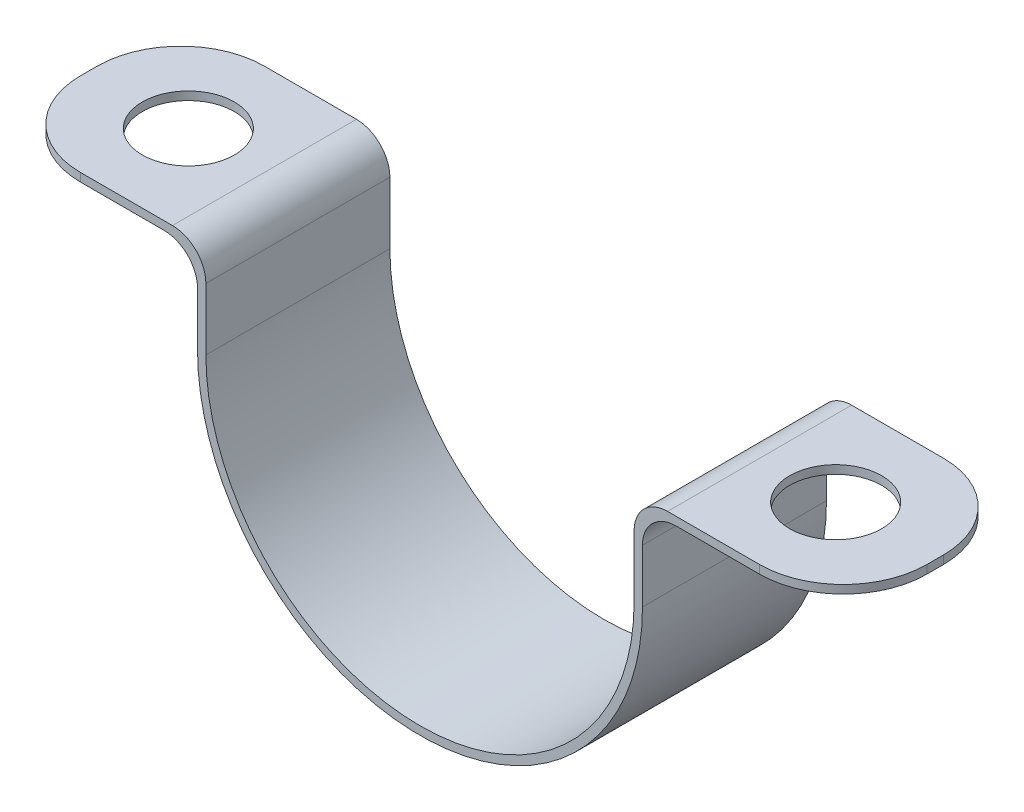
ISO-10303-21;
HEADER;
FILE_DESCRIPTION(('STEP AP214'),'2;1');
FILE_NAME('part.step','',(''),(''),'','','');
FILE_SCHEMA(('AUTOMOTIVE_DESIGN { 1 0 10303 214 1 1 1 1 }'));
ENDSEC;
DATA;
#1=APPLICATION_CONTEXT('core data for automotive mechanical design processes');
#2=APPLICATION_PROTOCOL_DEFINITION('international standard','automotive_design',2000,#1);
#3=PRODUCT_CONTEXT('',#1,'mechanical');
#4=PRODUCT('Part','Part','',(#3));
#5=PRODUCT_RELATED_PRODUCT_CATEGORY('part','',(#4));
#6=PRODUCT_DEFINITION_FORMATION('','',#4);
#7=PRODUCT_DEFINITION_CONTEXT('part definition',#1,'design');
#8=PRODUCT_DEFINITION('design','',#6,#7);
#9=PRODUCT_DEFINITION_SHAPE('','',#8);
#10=(LENGTH_UNIT() NAMED_UNIT(*) SI_UNIT(.MILLI.,.METRE.));
#11=(NAMED_UNIT(*) PLANE_ANGLE_UNIT() SI_UNIT($,.RADIAN.));
#12=(NAMED_UNIT(*) SI_UNIT($,.STERADIAN.) SOLID_ANGLE_UNIT());
#13=UNCERTAINTY_MEASURE_WITH_UNIT(LENGTH_MEASURE(1.E-05),#10,'distance_accuracy_value','');
#14=(GEOMETRIC_REPRESENTATION_CONTEXT(3) GLOBAL_UNCERTAINTY_ASSIGNED_CONTEXT((#13)) GLOBAL_UNIT_ASSIGNED_CONTEXT((#10,
#11,#12)) REPRESENTATION_CONTEXT('',''));
#15=CARTESIAN_POINT('',(0.,0.,0.));
#16=DIRECTION('',(0.,0.,1.));
#17=DIRECTION('',(1.,0.,0.));
#18=AXIS2_PLACEMENT_3D('',#15,#16,#17);
#19=CARTESIAN_POINT('',(0.,0.,-11.));
#20=DIRECTION('',(0.,0.,1.));
#21=DIRECTION('',(1.,0.,0.));
#22=AXIS2_PLACEMENT_3D('',#19,#20,#21);
#23=CYLINDRICAL_SURFACE('',#22,12.8);
#24=CARTESIAN_POINT('',(0.,0.,0.));
#25=DIRECTION('',(0.,0.,-1.));
#26=DIRECTION('',(1.,0.,0.));
#27=AXIS2_PLACEMENT_3D('',#24,#25,#26);
#28=CIRCLE('',#27,12.8);
#29=CARTESIAN_POINT('',(12.8,0.,0.));
#30=VERTEX_POINT('',#29);
#31=CARTESIAN_POINT('',(-12.8,0.,0.));
#32=VERTEX_POINT('',#31);
#33=EDGE_CURVE('E242',#30,#32,#28,.T.);
#34=ORIENTED_EDGE('',*,*,#33,.F.);
#35=DIRECTION('',(0.,0.,1.));
#36=VECTOR('',#35,1.);
#37=CARTESIAN_POINT('',(12.8,0.,-11.));
#38=LINE('',#37,#36);
#39=CARTESIAN_POINT('',(12.8,0.,-11.));
#40=VERTEX_POINT('',#39);
#41=EDGE_CURVE('E203',#40,#30,#38,.T.);
#42=ORIENTED_EDGE('',*,*,#41,.F.);
#43=CARTESIAN_POINT('',(0.,0.,-11.));
#44=DIRECTION('',(0.,0.,-1.));
#45=DIRECTION('',(1.,0.,0.));
#46=AXIS2_PLACEMENT_3D('',#43,#44,#45);
#47=CIRCLE('',#46,12.8);
#48=CARTESIAN_POINT('',(-12.8,0.,-11.));
#49=VERTEX_POINT('',#48);
#50=EDGE_CURVE('E197',#40,#49,#47,.T.);
#51=ORIENTED_EDGE('',*,*,#50,.T.);
#52=DIRECTION('',(0.,0.,1.));
#53=VECTOR('',#52,1.);
#54=CARTESIAN_POINT('',(-12.8,0.,-11.));
#55=LINE('',#54,#53);
#56=EDGE_CURVE('E178',#49,#32,#55,.T.);
#57=ORIENTED_EDGE('',*,*,#56,.T.);
#58=EDGE_LOOP('',(#34,#42,#51,#57));
#59=FACE_BOUND('',#58,.T.);
#60=ADVANCED_FACE('F39',(#59),#23,.F.);
#61=CARTESIAN_POINT('',(12.8,0.,-11.));
#62=DIRECTION('',(-1.,0.,0.));
#63=DIRECTION('',(0.,-1.,0.));
#64=AXIS2_PLACEMENT_3D('',#61,#62,#63);
#65=PLANE('',#64);
#66=DIRECTION('',(0.,-1.,0.));
#67=VECTOR('',#66,1.);
#68=CARTESIAN_POINT('',(12.8,0.,0.));
#69=LINE('',#68,#67);
#70=CARTESIAN_POINT('',(12.8,3.7,0.));
#71=VERTEX_POINT('',#70);
#72=EDGE_CURVE('E204',#71,#30,#69,.T.);
#73=ORIENTED_EDGE('',*,*,#72,.F.);
#74=DIRECTION('',(0.,0.,1.));
#75=VECTOR('',#74,1.);
#76=CARTESIAN_POINT('',(12.8,3.7,-11.));
#77=LINE('',#76,#75);
#78=CARTESIAN_POINT('',(12.8,3.7,-11.));
#79=VERTEX_POINT('',#78);
#80=EDGE_CURVE('E277',#79,#71,#77,.T.);
#81=ORIENTED_EDGE('',*,*,#80,.F.);
#82=DIRECTION('',(0.,-1.,0.));
#83=VECTOR('',#82,1.);
#84=CARTESIAN_POINT('',(12.8,0.,-11.));
#85=LINE('',#84,#83);
#86=EDGE_CURVE('E189',#79,#40,#85,.T.);
#87=ORIENTED_EDGE('',*,*,#86,.T.);
#88=ORIENTED_EDGE('',*,*,#41,.T.);
#89=EDGE_LOOP('',(#73,#81,#87,#88));
#90=FACE_BOUND('',#89,.T.);
#91=ADVANCED_FACE('F365',(#90),#65,.T.);
#92=CARTESIAN_POINT('',(14.8,3.7,-11.));
#93=DIRECTION('',(0.,0.,1.));
#94=DIRECTION('',(1.,0.,0.));
#95=AXIS2_PLACEMENT_3D('',#92,#93,#94);
#96=CYLINDRICAL_SURFACE('',#95,2.);
#97=CARTESIAN_POINT('',(14.8,3.7,0.));
#98=DIRECTION('',(0.,0.,1.));
#99=DIRECTION('',(-1.,0.,0.));
#100=AXIS2_PLACEMENT_3D('',#97,#98,#99);
#101=CIRCLE('',#100,2.);
#102=CARTESIAN_POINT('',(14.8,5.7,0.));
#103=VERTEX_POINT('',#102);
#104=EDGE_CURVE('E207',#103,#71,#101,.T.);
#105=ORIENTED_EDGE('',*,*,#104,.F.);
#106=DIRECTION('',(0.,0.,1.));
#107=VECTOR('',#106,1.);
#108=CARTESIAN_POINT('',(14.8,5.7,-11.));
#109=LINE('',#108,#107);
#110=CARTESIAN_POINT('',(14.8,5.7,-11.));
#111=VERTEX_POINT('',#110);
#112=EDGE_CURVE('E279',#111,#103,#109,.T.);
#113=ORIENTED_EDGE('',*,*,#112,.F.);
#114=CARTESIAN_POINT('',(14.8,3.7,-11.));
#115=DIRECTION('',(0.,0.,1.));
#116=DIRECTION('',(-1.,0.,0.));
#117=AXIS2_PLACEMENT_3D('',#114,#115,#116);
#118=CIRCLE('',#117,2.);
#119=EDGE_CURVE('E238',#111,#79,#118,.T.);
#120=ORIENTED_EDGE('',*,*,#119,.T.);
#121=ORIENTED_EDGE('',*,*,#80,.T.);
#122=EDGE_LOOP('',(#105,#113,#120,#121));
#123=FACE_BOUND('',#122,.T.);
#124=ADVANCED_FACE('F370',(#123),#96,.T.);
#125=CARTESIAN_POINT('',(14.8,5.7,-11.));
#126=DIRECTION('',(0.,1.,0.));
#127=DIRECTION('',(-1.,0.,0.));
#128=AXIS2_PLACEMENT_3D('',#125,#126,#127);
#129=PLANE('',#128);
#130=CARTESIAN_POINT('',(19.35,5.7,-5.5));
#131=DIRECTION('',(0.,1.,0.));
#132=DIRECTION('',(-1.,0.,0.));
#133=AXIS2_PLACEMENT_3D('',#130,#131,#132);
#134=CIRCLE('',#133,2.75);
#135=CARTESIAN_POINT('',(16.6,5.7,-5.5));
#136=VERTEX_POINT('',#135);
#137=EDGE_CURVE('E210',#136,#136,#134,.F.);
#138=ORIENTED_EDGE('',*,*,#137,.T.);
#139=EDGE_LOOP('',(#138));
#140=FACE_BOUND('',#139,.T.);
#141=DIRECTION('',(-1.,0.,0.));
#142=VECTOR('',#141,1.);
#143=CARTESIAN_POINT('',(14.8,5.7,0.));
#144=LINE('',#143,#142);
#145=CARTESIAN_POINT('',(20.3,5.7,0.));
#146=VERTEX_POINT('',#145);
#147=EDGE_CURVE('E271',#146,#103,#144,.T.);
#148=ORIENTED_EDGE('',*,*,#147,.F.);
#149=CARTESIAN_POINT('',(20.3,5.7,-5.));
#150=DIRECTION('',(0.,1.,0.));
#151=DIRECTION('',(-1.,0.,0.));
#152=AXIS2_PLACEMENT_3D('',#149,#150,#151);
#153=CIRCLE('',#152,5.);
#154=CARTESIAN_POINT('',(25.3,5.7,-5.));
#155=VERTEX_POINT('',#154);
#156=EDGE_CURVE('E315',#146,#155,#153,.T.);
#157=ORIENTED_EDGE('',*,*,#156,.T.);
#158=DIRECTION('',(0.,0.,1.));
#159=VECTOR('',#158,1.);
#160=CARTESIAN_POINT('',(25.3,5.7,-11.));
#161=LINE('',#160,#159);
#162=CARTESIAN_POINT('',(25.3,5.7,-6.));
#163=VERTEX_POINT('',#162);
#164=EDGE_CURVE('E282',#163,#155,#161,.T.);
#165=ORIENTED_EDGE('',*,*,#164,.F.);
#166=CARTESIAN_POINT('',(20.3,5.7,-6.));
#167=DIRECTION('',(0.,1.,0.));
#168=DIRECTION('',(-1.,0.,0.));
#169=AXIS2_PLACEMENT_3D('',#166,#167,#168);
#170=CIRCLE('',#169,5.);
#171=CARTESIAN_POINT('',(20.3,5.7,-11.));
#172=VERTEX_POINT('',#171);
#173=EDGE_CURVE('E313',#163,#172,#170,.T.);
#174=ORIENTED_EDGE('',*,*,#173,.T.);
#175=DIRECTION('',(-1.,0.,0.));
#176=VECTOR('',#175,1.);
#177=CARTESIAN_POINT('',(14.8,5.7,-11.));
#178=LINE('',#177,#176);
#179=EDGE_CURVE('E236',#172,#111,#178,.T.);
#180=ORIENTED_EDGE('',*,*,#179,.T.);
#181=ORIENTED_EDGE('',*,*,#112,.T.);
#182=EDGE_LOOP('',(#148,#157,#165,#174,#180,#181));
#183=FACE_BOUND('',#182,.T.);
#184=ADVANCED_FACE('F352',(#140,#183),#129,.T.);
#185=CARTESIAN_POINT('',(25.3,5.7,-11.));
#186=DIRECTION('',(1.,0.,0.));
#187=DIRECTION('',(0.,0.,-1.));
#188=AXIS2_PLACEMENT_3D('',#185,#186,#187);
#189=PLANE('',#188);
#190=ORIENTED_EDGE('',*,*,#164,.T.);
#191=DIRECTION('',(0.,1.,0.));
#192=VECTOR('',#191,1.);
#193=CARTESIAN_POINT('',(25.3,5.7,-5.));
#194=LINE('',#193,#192);
#195=CARTESIAN_POINT('',(25.3,5.2,-5.));
#196=VERTEX_POINT('',#195);
#197=EDGE_CURVE('E320',#155,#196,#194,.F.);
#198=ORIENTED_EDGE('',*,*,#197,.T.);
#199=DIRECTION('',(0.,0.,1.));
#200=VECTOR('',#199,1.);
#201=CARTESIAN_POINT('',(25.3,5.2,-11.));
#202=LINE('',#201,#200);
#203=CARTESIAN_POINT('',(25.3,5.2,-6.));
#204=VERTEX_POINT('',#203);
#205=EDGE_CURVE('E285',#204,#196,#202,.T.);
#206=ORIENTED_EDGE('',*,*,#205,.F.);
#207=DIRECTION('',(0.,1.,0.));
#208=VECTOR('',#207,1.);
#209=CARTESIAN_POINT('',(25.3,5.7,-6.));
#210=LINE('',#209,#208);
#211=EDGE_CURVE('E317',#204,#163,#210,.T.);
#212=ORIENTED_EDGE('',*,*,#211,.T.);
#213=EDGE_LOOP('',(#190,#198,#206,#212));
#214=FACE_BOUND('',#213,.T.);
#215=ADVANCED_FACE('F438',(#214),#189,.T.);
#216=CARTESIAN_POINT('',(25.3,5.2,-11.));
#217=DIRECTION('',(0.,-1.,0.));
#218=DIRECTION('',(1.,0.,0.));
#219=AXIS2_PLACEMENT_3D('',#216,#217,#218);
#220=PLANE('',#219);
#221=CARTESIAN_POINT('',(19.35,5.2,-5.5));
#222=DIRECTION('',(0.,-1.,0.));
#223=DIRECTION('',(1.,0.,0.));
#224=AXIS2_PLACEMENT_3D('',#221,#222,#223);
#225=CIRCLE('',#224,2.75);
#226=CARTESIAN_POINT('',(22.1,5.2,-5.5));
#227=VERTEX_POINT('',#226);
#228=EDGE_CURVE('E43',#227,#227,#225,.F.);
#229=ORIENTED_EDGE('',*,*,#228,.T.);
#230=EDGE_LOOP('',(#229));
#231=FACE_BOUND('',#230,.T.);
#232=ORIENTED_EDGE('',*,*,#205,.T.);
#233=CARTESIAN_POINT('',(20.3,5.2,-5.));
#234=DIRECTION('',(0.,-1.,0.));
#235=DIRECTION('',(1.,0.,0.));
#236=AXIS2_PLACEMENT_3D('',#233,#234,#235);
#237=CIRCLE('',#236,5.);
#238=CARTESIAN_POINT('',(20.3,5.2,0.));
#239=VERTEX_POINT('',#238);
#240=EDGE_CURVE('E324',#196,#239,#237,.T.);
#241=ORIENTED_EDGE('',*,*,#240,.T.);
#242=DIRECTION('',(1.,0.,0.));
#243=VECTOR('',#242,1.);
#244=CARTESIAN_POINT('',(25.3,5.2,0.));
#245=LINE('',#244,#243);
#246=CARTESIAN_POINT('',(15.3,5.19999999999999,0.));
#247=VERTEX_POINT('',#246);
#248=EDGE_CURVE('E268',#247,#239,#245,.T.);
#249=ORIENTED_EDGE('',*,*,#248,.F.);
#250=DIRECTION('',(0.,0.,1.));
#251=VECTOR('',#250,1.);
#252=CARTESIAN_POINT('',(15.3,5.19999999999999,-11.));
#253=LINE('',#252,#251);
#254=CARTESIAN_POINT('',(15.3,5.19999999999999,-11.));
#255=VERTEX_POINT('',#254);
#256=EDGE_CURVE('E288',#255,#247,#253,.T.);
#257=ORIENTED_EDGE('',*,*,#256,.F.);
#258=DIRECTION('',(1.,0.,0.));
#259=VECTOR('',#258,1.);
#260=CARTESIAN_POINT('',(25.3,5.2,-11.));
#261=LINE('',#260,#259);
#262=CARTESIAN_POINT('',(20.3,5.2,-11.));
#263=VERTEX_POINT('',#262);
#264=EDGE_CURVE('E233',#255,#263,#261,.T.);
#265=ORIENTED_EDGE('',*,*,#264,.T.);
#266=CARTESIAN_POINT('',(20.3,5.2,-6.));
#267=DIRECTION('',(0.,-1.,0.));
#268=DIRECTION('',(1.,0.,0.));
#269=AXIS2_PLACEMENT_3D('',#266,#267,#268);
#270=CIRCLE('',#269,5.);
#271=EDGE_CURVE('E322',#263,#204,#270,.T.);
#272=ORIENTED_EDGE('',*,*,#271,.T.);
#273=EDGE_LOOP('',(#232,#241,#249,#257,#265,#272));
#274=FACE_BOUND('',#273,.T.);
#275=ADVANCED_FACE('F431',(#231,#274),#220,.T.);
#276=CARTESIAN_POINT('',(15.3,3.19999999999999,-11.));
#277=DIRECTION('',(0.,0.,1.));
#278=DIRECTION('',(1.,0.,0.));
#279=AXIS2_PLACEMENT_3D('',#276,#277,#278);
#280=CYLINDRICAL_SURFACE('',#279,2.);
#281=CARTESIAN_POINT('',(15.3,3.19999999999999,0.));
#282=DIRECTION('',(0.,0.,-1.));
#283=DIRECTION('',(-1.,0.,0.));
#284=AXIS2_PLACEMENT_3D('',#281,#282,#283);
#285=CIRCLE('',#284,2.);
#286=CARTESIAN_POINT('',(13.3,3.19999999999999,0.));
#287=VERTEX_POINT('',#286);
#288=EDGE_CURVE('E265',#287,#247,#285,.T.);
#289=ORIENTED_EDGE('',*,*,#288,.F.);
#290=DIRECTION('',(0.,0.,1.));
#291=VECTOR('',#290,1.);
#292=CARTESIAN_POINT('',(13.3,3.19999999999999,-11.));
#293=LINE('',#292,#291);
#294=CARTESIAN_POINT('',(13.3,3.19999999999999,-11.));
#295=VERTEX_POINT('',#294);
#296=EDGE_CURVE('E290',#295,#287,#293,.T.);
#297=ORIENTED_EDGE('',*,*,#296,.F.);
#298=CARTESIAN_POINT('',(15.3,3.19999999999999,-11.));
#299=DIRECTION('',(0.,0.,-1.));
#300=DIRECTION('',(-1.,0.,0.));
#301=AXIS2_PLACEMENT_3D('',#298,#299,#300);
#302=CIRCLE('',#301,2.);
#303=EDGE_CURVE('E230',#295,#255,#302,.T.);
#304=ORIENTED_EDGE('',*,*,#303,.T.);
#305=ORIENTED_EDGE('',*,*,#256,.T.);
#306=EDGE_LOOP('',(#289,#297,#304,#305));
#307=FACE_BOUND('',#306,.T.);
#308=ADVANCED_FACE('F427',(#307),#280,.F.);
#309=CARTESIAN_POINT('',(13.3,0.,-11.));
#310=DIRECTION('',(1.,0.,0.));
#311=DIRECTION('',(0.,1.,0.));
#312=AXIS2_PLACEMENT_3D('',#309,#310,#311);
#313=PLANE('',#312);
#314=DIRECTION('',(0.,1.,0.));
#315=VECTOR('',#314,1.);
#316=CARTESIAN_POINT('',(13.3,0.,0.));
#317=LINE('',#316,#315);
#318=CARTESIAN_POINT('',(13.3,0.,0.));
#319=VERTEX_POINT('',#318);
#320=EDGE_CURVE('E262',#319,#287,#317,.T.);
#321=ORIENTED_EDGE('',*,*,#320,.F.);
#322=DIRECTION('',(0.,0.,1.));
#323=VECTOR('',#322,1.);
#324=CARTESIAN_POINT('',(13.3,0.,-11.));
#325=LINE('',#324,#323);
#326=CARTESIAN_POINT('',(13.3,0.,-11.));
#327=VERTEX_POINT('',#326);
#328=EDGE_CURVE('E292',#327,#319,#325,.T.);
#329=ORIENTED_EDGE('',*,*,#328,.F.);
#330=DIRECTION('',(0.,1.,0.));
#331=VECTOR('',#330,1.);
#332=CARTESIAN_POINT('',(13.3,0.,-11.));
#333=LINE('',#332,#331);
#334=EDGE_CURVE('E227',#327,#295,#333,.T.);
#335=ORIENTED_EDGE('',*,*,#334,.T.);
#336=ORIENTED_EDGE('',*,*,#296,.T.);
#337=EDGE_LOOP('',(#321,#329,#335,#336));
#338=FACE_BOUND('',#337,.T.);
#339=ADVANCED_FACE('F423',(#338),#313,.T.);
#340=CARTESIAN_POINT('',(0.,0.,-11.));
#341=DIRECTION('',(0.,0.,1.));
#342=DIRECTION('',(1.,0.,0.));
#343=AXIS2_PLACEMENT_3D('',#340,#341,#342);
#344=CYLINDRICAL_SURFACE('',#343,13.3);
#345=CARTESIAN_POINT('',(0.,0.,0.));
#346=DIRECTION('',(0.,0.,1.));
#347=DIRECTION('',(1.,0.,0.));
#348=AXIS2_PLACEMENT_3D('',#345,#346,#347);
#349=CIRCLE('',#348,13.3);
#350=CARTESIAN_POINT('',(-13.3,0.,0.));
#351=VERTEX_POINT('',#350);
#352=EDGE_CURVE('E259',#351,#319,#349,.T.);
#353=ORIENTED_EDGE('',*,*,#352,.F.);
#354=DIRECTION('',(0.,0.,1.));
#355=VECTOR('',#354,1.);
#356=CARTESIAN_POINT('',(-13.3,0.,-11.));
#357=LINE('',#356,#355);
#358=CARTESIAN_POINT('',(-13.3,0.,-11.));
#359=VERTEX_POINT('',#358);
#360=EDGE_CURVE('E294',#359,#351,#357,.T.);
#361=ORIENTED_EDGE('',*,*,#360,.F.);
#362=CARTESIAN_POINT('',(0.,0.,-11.));
#363=DIRECTION('',(0.,0.,1.));
#364=DIRECTION('',(1.,0.,0.));
#365=AXIS2_PLACEMENT_3D('',#362,#363,#364);
#366=CIRCLE('',#365,13.3);
#367=EDGE_CURVE('E224',#359,#327,#366,.T.);
#368=ORIENTED_EDGE('',*,*,#367,.T.);
#369=ORIENTED_EDGE('',*,*,#328,.T.);
#370=EDGE_LOOP('',(#353,#361,#368,#369));
#371=FACE_BOUND('',#370,.T.);
#372=ADVANCED_FACE('F419',(#371),#344,.T.);
#373=CARTESIAN_POINT('',(-13.3,0.,-11.));
#374=DIRECTION('',(-1.,0.,0.));
#375=DIRECTION('',(0.,-1.,0.));
#376=AXIS2_PLACEMENT_3D('',#373,#374,#375);
#377=PLANE('',#376);
#378=DIRECTION('',(0.,-1.,0.));
#379=VECTOR('',#378,1.);
#380=CARTESIAN_POINT('',(-13.3,0.,0.));
#381=LINE('',#380,#379);
#382=CARTESIAN_POINT('',(-13.3,3.2,0.));
#383=VERTEX_POINT('',#382);
#384=EDGE_CURVE('E256',#383,#351,#381,.T.);
#385=ORIENTED_EDGE('',*,*,#384,.F.);
#386=DIRECTION('',(0.,0.,1.));
#387=VECTOR('',#386,1.);
#388=CARTESIAN_POINT('',(-13.3,3.2,-11.));
#389=LINE('',#388,#387);
#390=CARTESIAN_POINT('',(-13.3,3.2,-11.));
#391=VERTEX_POINT('',#390);
#392=EDGE_CURVE('E296',#391,#383,#389,.T.);
#393=ORIENTED_EDGE('',*,*,#392,.F.);
#394=DIRECTION('',(0.,-1.,0.));
#395=VECTOR('',#394,1.);
#396=CARTESIAN_POINT('',(-13.3,0.,-11.));
#397=LINE('',#396,#395);
#398=EDGE_CURVE('E221',#391,#359,#397,.T.);
#399=ORIENTED_EDGE('',*,*,#398,.T.);
#400=ORIENTED_EDGE('',*,*,#360,.T.);
#401=EDGE_LOOP('',(#385,#393,#399,#400));
#402=FACE_BOUND('',#401,.T.);
#403=ADVANCED_FACE('F415',(#402),#377,.T.);
#404=CARTESIAN_POINT('',(-15.3,3.2,-11.));
#405=DIRECTION('',(0.,0.,1.));
#406=DIRECTION('',(1.,0.,0.));
#407=AXIS2_PLACEMENT_3D('',#404,#405,#406);
#408=CYLINDRICAL_SURFACE('',#407,2.);
#409=CARTESIAN_POINT('',(-15.3,3.2,0.));
#410=DIRECTION('',(0.,0.,-1.));
#411=DIRECTION('',(1.,0.,0.));
#412=AXIS2_PLACEMENT_3D('',#409,#410,#411);
#413=CIRCLE('',#412,2.);
#414=CARTESIAN_POINT('',(-15.3,5.2,0.));
#415=VERTEX_POINT('',#414);
#416=EDGE_CURVE('E253',#415,#383,#413,.T.);
#417=ORIENTED_EDGE('',*,*,#416,.F.);
#418=DIRECTION('',(0.,0.,1.));
#419=VECTOR('',#418,1.);
#420=CARTESIAN_POINT('',(-15.3,5.2,-11.));
#421=LINE('',#420,#419);
#422=CARTESIAN_POINT('',(-15.3,5.2,-11.));
#423=VERTEX_POINT('',#422);
#424=EDGE_CURVE('E298',#423,#415,#421,.T.);
#425=ORIENTED_EDGE('',*,*,#424,.F.);
#426=CARTESIAN_POINT('',(-15.3,3.2,-11.));
#427=DIRECTION('',(0.,0.,-1.));
#428=DIRECTION('',(1.,0.,0.));
#429=AXIS2_PLACEMENT_3D('',#426,#427,#428);
#430=CIRCLE('',#429,2.);
#431=EDGE_CURVE('E218',#423,#391,#430,.T.);
#432=ORIENTED_EDGE('',*,*,#431,.T.);
#433=ORIENTED_EDGE('',*,*,#392,.T.);
#434=EDGE_LOOP('',(#417,#425,#432,#433));
#435=FACE_BOUND('',#434,.T.);
#436=ADVANCED_FACE('F412',(#435),#408,.F.);
#437=CARTESIAN_POINT('',(-25.3,5.2,-11.));
#438=DIRECTION('',(0.,-1.,0.));
#439=DIRECTION('',(1.,0.,0.));
#440=AXIS2_PLACEMENT_3D('',#437,#438,#439);
#441=PLANE('',#440);
#442=CARTESIAN_POINT('',(-19.35,5.2,-5.5));
#443=DIRECTION('',(0.,-1.,0.));
#444=DIRECTION('',(1.,0.,0.));
#445=AXIS2_PLACEMENT_3D('',#442,#443,#444);
#446=CIRCLE('',#445,2.75);
#447=CARTESIAN_POINT('',(-16.6,5.2,-5.5));
#448=VERTEX_POINT('',#447);
#449=EDGE_CURVE('E340',#448,#448,#446,.T.);
#450=ORIENTED_EDGE('',*,*,#449,.F.);
#451=EDGE_LOOP('',(#450));
#452=FACE_BOUND('',#451,.T.);
#453=DIRECTION('',(1.,0.,0.));
#454=VECTOR('',#453,1.);
#455=CARTESIAN_POINT('',(-25.3,5.2,0.));
#456=LINE('',#455,#454);
#457=CARTESIAN_POINT('',(-20.3,5.2,0.));
#458=VERTEX_POINT('',#457);
#459=EDGE_CURVE('E251',#458,#415,#456,.T.);
#460=ORIENTED_EDGE('',*,*,#459,.F.);
#461=CARTESIAN_POINT('',(-20.3,5.2,-5.));
#462=DIRECTION('',(0.,-1.,0.));
#463=DIRECTION('',(1.,0.,0.));
#464=AXIS2_PLACEMENT_3D('',#461,#462,#463);
#465=CIRCLE('',#464,5.);
#466=CARTESIAN_POINT('',(-25.3,5.2,-5.));
#467=VERTEX_POINT('',#466);
#468=EDGE_CURVE('E332',#458,#467,#465,.T.);
#469=ORIENTED_EDGE('',*,*,#468,.T.);
#470=DIRECTION('',(0.,0.,1.));
#471=VECTOR('',#470,1.);
#472=CARTESIAN_POINT('',(-25.3,5.2,-11.));
#473=LINE('',#472,#471);
#474=CARTESIAN_POINT('',(-25.3,5.2,-6.));
#475=VERTEX_POINT('',#474);
#476=EDGE_CURVE('E301',#475,#467,#473,.T.);
#477=ORIENTED_EDGE('',*,*,#476,.F.);
#478=CARTESIAN_POINT('',(-20.3,5.2,-6.));
#479=DIRECTION('',(0.,-1.,0.));
#480=DIRECTION('',(1.,0.,0.));
#481=AXIS2_PLACEMENT_3D('',#478,#479,#480);
#482=CIRCLE('',#481,5.);
#483=CARTESIAN_POINT('',(-20.3,5.2,-11.));
#484=VERTEX_POINT('',#483);
#485=EDGE_CURVE('E330',#475,#484,#482,.T.);
#486=ORIENTED_EDGE('',*,*,#485,.T.);
#487=DIRECTION('',(1.,0.,0.));
#488=VECTOR('',#487,1.);
#489=CARTESIAN_POINT('',(-25.3,5.2,-11.));
#490=LINE('',#489,#488);
#491=EDGE_CURVE('E216',#484,#423,#490,.T.);
#492=ORIENTED_EDGE('',*,*,#491,.T.);
#493=ORIENTED_EDGE('',*,*,#424,.T.);
#494=EDGE_LOOP('',(#460,#469,#477,#486,#492,#493));
#495=FACE_BOUND('',#494,.T.);
#496=ADVANCED_FACE('F407',(#452,#495),#441,.T.);
#497=CARTESIAN_POINT('',(-25.3,5.7,-11.));
#498=DIRECTION('',(-1.,0.,0.));
#499=DIRECTION('',(0.,0.,1.));
#500=AXIS2_PLACEMENT_3D('',#497,#498,#499);
#501=PLANE('',#500);
#502=ORIENTED_EDGE('',*,*,#476,.T.);
#503=DIRECTION('',(0.,-1.,0.));
#504=VECTOR('',#503,1.);
#505=CARTESIAN_POINT('',(-25.3,5.7,-5.));
#506=LINE('',#505,#504);
#507=CARTESIAN_POINT('',(-25.3,5.7,-5.));
#508=VERTEX_POINT('',#507);
#509=EDGE_CURVE('E56',#467,#508,#506,.F.);
#510=ORIENTED_EDGE('',*,*,#509,.T.);
#511=DIRECTION('',(0.,0.,1.));
#512=VECTOR('',#511,1.);
#513=CARTESIAN_POINT('',(-25.3,5.7,-11.));
#514=LINE('',#513,#512);
#515=CARTESIAN_POINT('',(-25.3,5.7,-6.));
#516=VERTEX_POINT('',#515);
#517=EDGE_CURVE('E303',#516,#508,#514,.T.);
#518=ORIENTED_EDGE('',*,*,#517,.F.);
#519=DIRECTION('',(0.,-1.,0.));
#520=VECTOR('',#519,1.);
#521=CARTESIAN_POINT('',(-25.3,5.2,-6.));
#522=LINE('',#521,#520);
#523=EDGE_CURVE('E334',#516,#475,#522,.T.);
#524=ORIENTED_EDGE('',*,*,#523,.T.);
#525=EDGE_LOOP('',(#502,#510,#518,#524));
#526=FACE_BOUND('',#525,.T.);
#527=ADVANCED_FACE('F405',(#526),#501,.T.);
#528=CARTESIAN_POINT('',(-14.8,5.7,-11.));
#529=DIRECTION('',(0.,1.,0.));
#530=DIRECTION('',(-1.,0.,0.));
#531=AXIS2_PLACEMENT_3D('',#528,#529,#530);
#532=PLANE('',#531);
#533=CARTESIAN_POINT('',(-19.35,5.7,-5.5));
#534=DIRECTION('',(0.,1.,0.));
#535=DIRECTION('',(-1.,0.,0.));
#536=AXIS2_PLACEMENT_3D('',#533,#534,#535);
#537=CIRCLE('',#536,2.75);
#538=CARTESIAN_POINT('',(-22.1,5.7,-5.5));
#539=VERTEX_POINT('',#538);
#540=EDGE_CURVE('E338',#539,#539,#537,.T.);
#541=ORIENTED_EDGE('',*,*,#540,.F.);
#542=EDGE_LOOP('',(#541));
#543=FACE_BOUND('',#542,.T.);
#544=ORIENTED_EDGE('',*,*,#517,.T.);
#545=CARTESIAN_POINT('',(-20.3,5.7,-5.));
#546=DIRECTION('',(0.,1.,0.));
#547=DIRECTION('',(-1.,0.,0.));
#548=AXIS2_PLACEMENT_3D('',#545,#546,#547);
#549=CIRCLE('',#548,5.);
#550=CARTESIAN_POINT('',(-20.3,5.7,0.));
#551=VERTEX_POINT('',#550);
#552=EDGE_CURVE('E11',#508,#551,#549,.T.);
#553=ORIENTED_EDGE('',*,*,#552,.T.);
#554=DIRECTION('',(-1.,0.,0.));
#555=VECTOR('',#554,1.);
#556=CARTESIAN_POINT('',(-14.8,5.7,0.));
#557=LINE('',#556,#555);
#558=CARTESIAN_POINT('',(-14.8,5.7,0.));
#559=VERTEX_POINT('',#558);
#560=EDGE_CURVE('E248',#559,#551,#557,.T.);
#561=ORIENTED_EDGE('',*,*,#560,.F.);
#562=DIRECTION('',(0.,0.,1.));
#563=VECTOR('',#562,1.);
#564=CARTESIAN_POINT('',(-14.8,5.7,-11.));
#565=LINE('',#564,#563);
#566=CARTESIAN_POINT('',(-14.8,5.7,-11.));
#567=VERTEX_POINT('',#566);
#568=EDGE_CURVE('E305',#567,#559,#565,.T.);
#569=ORIENTED_EDGE('',*,*,#568,.F.);
#570=DIRECTION('',(-1.,0.,0.));
#571=VECTOR('',#570,1.);
#572=CARTESIAN_POINT('',(-14.8,5.7,-11.));
#573=LINE('',#572,#571);
#574=CARTESIAN_POINT('',(-20.3,5.7,-11.));
#575=VERTEX_POINT('',#574);
#576=EDGE_CURVE('E214',#567,#575,#573,.T.);
#577=ORIENTED_EDGE('',*,*,#576,.T.);
#578=CARTESIAN_POINT('',(-20.3,5.7,-6.));
#579=DIRECTION('',(0.,1.,0.));
#580=DIRECTION('',(-1.,0.,0.));
#581=AXIS2_PLACEMENT_3D('',#578,#579,#580);
#582=CIRCLE('',#581,5.);
#583=EDGE_CURVE('E48',#575,#516,#582,.T.);
#584=ORIENTED_EDGE('',*,*,#583,.T.);
#585=EDGE_LOOP('',(#544,#553,#561,#569,#577,#584));
#586=FACE_BOUND('',#585,.T.);
#587=ADVANCED_FACE('F394',(#543,#586),#532,.T.);
#588=CARTESIAN_POINT('',(-14.8,3.7,-11.));
#589=DIRECTION('',(0.,0.,1.));
#590=DIRECTION('',(1.,0.,0.));
#591=AXIS2_PLACEMENT_3D('',#588,#589,#590);
#592=CYLINDRICAL_SURFACE('',#591,2.);
#593=CARTESIAN_POINT('',(-14.8,3.7,0.));
#594=DIRECTION('',(0.,0.,1.));
#595=DIRECTION('',(1.,0.,0.));
#596=AXIS2_PLACEMENT_3D('',#593,#594,#595);
#597=CIRCLE('',#596,2.);
#598=CARTESIAN_POINT('',(-12.8,3.7,0.));
#599=VERTEX_POINT('',#598);
#600=EDGE_CURVE('E245',#599,#559,#597,.T.);
#601=ORIENTED_EDGE('',*,*,#600,.F.);
#602=DIRECTION('',(0.,0.,1.));
#603=VECTOR('',#602,1.);
#604=CARTESIAN_POINT('',(-12.8,3.7,-11.));
#605=LINE('',#604,#603);
#606=CARTESIAN_POINT('',(-12.8,3.7,-11.));
#607=VERTEX_POINT('',#606);
#608=EDGE_CURVE('E188',#607,#599,#605,.T.);
#609=ORIENTED_EDGE('',*,*,#608,.F.);
#610=CARTESIAN_POINT('',(-14.8,3.7,-11.));
#611=DIRECTION('',(0.,0.,1.));
#612=DIRECTION('',(1.,0.,0.));
#613=AXIS2_PLACEMENT_3D('',#610,#611,#612);
#614=CIRCLE('',#613,2.);
#615=EDGE_CURVE('E201',#607,#567,#614,.T.);
#616=ORIENTED_EDGE('',*,*,#615,.T.);
#617=ORIENTED_EDGE('',*,*,#568,.T.);
#618=EDGE_LOOP('',(#601,#609,#616,#617));
#619=FACE_BOUND('',#618,.T.);
#620=ADVANCED_FACE('F399',(#619),#592,.T.);
#621=CARTESIAN_POINT('',(-12.8,0.,-11.));
#622=DIRECTION('',(1.,0.,0.));
#623=DIRECTION('',(0.,1.,0.));
#624=AXIS2_PLACEMENT_3D('',#621,#622,#623);
#625=PLANE('',#624);
#626=DIRECTION('',(0.,1.,0.));
#627=VECTOR('',#626,1.);
#628=CARTESIAN_POINT('',(-12.8,0.,0.));
#629=LINE('',#628,#627);
#630=EDGE_CURVE('E183',#32,#599,#629,.T.);
#631=ORIENTED_EDGE('',*,*,#630,.F.);
#632=ORIENTED_EDGE('',*,*,#56,.F.);
#633=DIRECTION('',(0.,1.,0.));
#634=VECTOR('',#633,1.);
#635=CARTESIAN_POINT('',(-12.8,0.,-11.));
#636=LINE('',#635,#634);
#637=EDGE_CURVE('E181',#49,#607,#636,.T.);
#638=ORIENTED_EDGE('',*,*,#637,.T.);
#639=ORIENTED_EDGE('',*,*,#608,.T.);
#640=EDGE_LOOP('',(#631,#632,#638,#639));
#641=FACE_BOUND('',#640,.T.);
#642=ADVANCED_FACE('F180',(#641),#625,.T.);
#643=CARTESIAN_POINT('',(0.,0.,-11.));
#644=DIRECTION('',(0.,0.,1.));
#645=DIRECTION('',(1.,0.,0.));
#646=AXIS2_PLACEMENT_3D('',#643,#644,#645);
#647=PLANE('',#646);
#648=ORIENTED_EDGE('',*,*,#179,.F.);
#649=DIRECTION('',(0.,1.,0.));
#650=VECTOR('',#649,1.);
#651=CARTESIAN_POINT('',(20.3,5.2,-11.));
#652=LINE('',#651,#650);
#653=EDGE_CURVE('E328',#172,#263,#652,.F.);
#654=ORIENTED_EDGE('',*,*,#653,.T.);
#655=ORIENTED_EDGE('',*,*,#264,.F.);
#656=ORIENTED_EDGE('',*,*,#303,.F.);
#657=ORIENTED_EDGE('',*,*,#334,.F.);
#658=ORIENTED_EDGE('',*,*,#367,.F.);
#659=ORIENTED_EDGE('',*,*,#398,.F.);
#660=ORIENTED_EDGE('',*,*,#431,.F.);
#661=ORIENTED_EDGE('',*,*,#491,.F.);
#662=DIRECTION('',(0.,-1.,0.));
#663=VECTOR('',#662,1.);
#664=CARTESIAN_POINT('',(-20.3,5.7,-11.));
#665=LINE('',#664,#663);
#666=EDGE_CURVE('E326',#484,#575,#665,.F.);
#667=ORIENTED_EDGE('',*,*,#666,.T.);
#668=ORIENTED_EDGE('',*,*,#576,.F.);
#669=ORIENTED_EDGE('',*,*,#615,.F.);
#670=ORIENTED_EDGE('',*,*,#637,.F.);
#671=ORIENTED_EDGE('',*,*,#50,.F.);
#672=ORIENTED_EDGE('',*,*,#86,.F.);
#673=ORIENTED_EDGE('',*,*,#119,.F.);
#674=EDGE_LOOP('',(#648,#654,#655,#656,#657,#658,#659,#660,#661,#667,#668,#669,#670,#671,#672,#673));
#675=FACE_BOUND('',#674,.T.);
#676=ADVANCED_FACE('F195',(#675),#647,.F.);
#677=CARTESIAN_POINT('',(0.,0.,0.));
#678=DIRECTION('',(0.,0.,1.));
#679=DIRECTION('',(1.,0.,0.));
#680=AXIS2_PLACEMENT_3D('',#677,#678,#679);
#681=PLANE('',#680);
#682=ORIENTED_EDGE('',*,*,#248,.T.);
#683=DIRECTION('',(0.,1.,0.));
#684=VECTOR('',#683,1.);
#685=CARTESIAN_POINT('',(20.3,0.,0.));
#686=LINE('',#685,#684);
#687=EDGE_CURVE('E310',#239,#146,#686,.T.);
#688=ORIENTED_EDGE('',*,*,#687,.T.);
#689=ORIENTED_EDGE('',*,*,#147,.T.);
#690=ORIENTED_EDGE('',*,*,#104,.T.);
#691=ORIENTED_EDGE('',*,*,#72,.T.);
#692=ORIENTED_EDGE('',*,*,#33,.T.);
#693=ORIENTED_EDGE('',*,*,#630,.T.);
#694=ORIENTED_EDGE('',*,*,#600,.T.);
#695=ORIENTED_EDGE('',*,*,#560,.T.);
#696=DIRECTION('',(0.,-1.,0.));
#697=VECTOR('',#696,1.);
#698=CARTESIAN_POINT('',(-20.3,0.,0.));
#699=LINE('',#698,#697);
#700=EDGE_CURVE('E276',#551,#458,#699,.T.);
#701=ORIENTED_EDGE('',*,*,#700,.T.);
#702=ORIENTED_EDGE('',*,*,#459,.T.);
#703=ORIENTED_EDGE('',*,*,#416,.T.);
#704=ORIENTED_EDGE('',*,*,#384,.T.);
#705=ORIENTED_EDGE('',*,*,#352,.T.);
#706=ORIENTED_EDGE('',*,*,#320,.T.);
#707=ORIENTED_EDGE('',*,*,#288,.T.);
#708=EDGE_LOOP('',(#682,#688,#689,#690,#691,#692,#693,#694,#695,#701,#702,#703,#704,#705,#706,#707));
#709=FACE_BOUND('',#708,.T.);
#710=ADVANCED_FACE('F380',(#709),#681,.T.);
#711=CARTESIAN_POINT('',(20.3,0.,-5.));
#712=DIRECTION('',(0.,1.,0.));
#713=DIRECTION('',(0.,0.,1.));
#714=AXIS2_PLACEMENT_3D('',#711,#712,#713);
#715=CYLINDRICAL_SURFACE('',#714,5.);
#716=ORIENTED_EDGE('',*,*,#240,.F.);
#717=ORIENTED_EDGE('',*,*,#197,.F.);
#718=ORIENTED_EDGE('',*,*,#156,.F.);
#719=ORIENTED_EDGE('',*,*,#687,.F.);
#720=EDGE_LOOP('',(#716,#717,#718,#719));
#721=FACE_BOUND('',#720,.T.);
#722=ADVANCED_FACE('F376',(#721),#715,.T.);
#723=CARTESIAN_POINT('',(20.3,5.7,-6.));
#724=DIRECTION('',(0.,-1.,0.));
#725=DIRECTION('',(0.,0.,-1.));
#726=AXIS2_PLACEMENT_3D('',#723,#724,#725);
#727=CYLINDRICAL_SURFACE('',#726,5.);
#728=ORIENTED_EDGE('',*,*,#271,.F.);
#729=ORIENTED_EDGE('',*,*,#653,.F.);
#730=ORIENTED_EDGE('',*,*,#173,.F.);
#731=ORIENTED_EDGE('',*,*,#211,.F.);
#732=EDGE_LOOP('',(#728,#729,#730,#731));
#733=FACE_BOUND('',#732,.T.);
#734=ADVANCED_FACE('F379',(#733),#727,.T.);
#735=CARTESIAN_POINT('',(-20.3,0.,-5.));
#736=DIRECTION('',(0.,-1.,0.));
#737=DIRECTION('',(0.,0.,-1.));
#738=AXIS2_PLACEMENT_3D('',#735,#736,#737);
#739=CYLINDRICAL_SURFACE('',#738,5.);
#740=ORIENTED_EDGE('',*,*,#552,.F.);
#741=ORIENTED_EDGE('',*,*,#509,.F.);
#742=ORIENTED_EDGE('',*,*,#468,.F.);
#743=ORIENTED_EDGE('',*,*,#700,.F.);
#744=EDGE_LOOP('',(#740,#741,#742,#743));
#745=FACE_BOUND('',#744,.T.);
#746=ADVANCED_FACE('F383',(#745),#739,.T.);
#747=CARTESIAN_POINT('',(-20.3,5.7,-6.));
#748=DIRECTION('',(0.,1.,0.));
#749=DIRECTION('',(0.,0.,1.));
#750=AXIS2_PLACEMENT_3D('',#747,#748,#749);
#751=CYLINDRICAL_SURFACE('',#750,5.);
#752=ORIENTED_EDGE('',*,*,#583,.F.);
#753=ORIENTED_EDGE('',*,*,#666,.F.);
#754=ORIENTED_EDGE('',*,*,#485,.F.);
#755=ORIENTED_EDGE('',*,*,#523,.F.);
#756=EDGE_LOOP('',(#752,#753,#754,#755));
#757=FACE_BOUND('',#756,.T.);
#758=ADVANCED_FACE('F41',(#757),#751,.T.);
#759=CARTESIAN_POINT('',(-19.35,10.,-5.5));
#760=DIRECTION('',(0.,-1.,0.));
#761=DIRECTION('',(0.,0.,-1.));
#762=AXIS2_PLACEMENT_3D('',#759,#760,#761);
#763=CYLINDRICAL_SURFACE('',#762,2.75);
#764=ORIENTED_EDGE('',*,*,#449,.T.);
#765=EDGE_LOOP('',(#764));
#766=FACE_BOUND('',#765,.T.);
#767=ORIENTED_EDGE('',*,*,#540,.T.);
#768=EDGE_LOOP('',(#767));
#769=FACE_BOUND('',#768,.T.);
#770=ADVANCED_FACE('F358',(#766,#769),#763,.F.);
#771=CARTESIAN_POINT('',(19.35,10.,-5.5));
#772=DIRECTION('',(0.,-1.,0.));
#773=DIRECTION('',(0.,0.,-1.));
#774=AXIS2_PLACEMENT_3D('',#771,#772,#773);
#775=CYLINDRICAL_SURFACE('',#774,2.75);
#776=ORIENTED_EDGE('',*,*,#137,.F.);
#777=EDGE_LOOP('',(#776));
#778=FACE_BOUND('',#777,.T.);
#779=ORIENTED_EDGE('',*,*,#228,.F.);
#780=EDGE_LOOP('',(#779));
#781=FACE_BOUND('',#780,.T.);
#782=ADVANCED_FACE('F355',(#778,#781),#775,.F.);
#783=CLOSED_SHELL('',(#60,#91,#124,#184,#215,#275,#308,#339,#372,#403,#436,#496,#527,#587,#620,
#642,#676,#710,#722,#734,#746,#758,#770,#782));
#784=MANIFOLD_SOLID_BREP('B2',#783);
#785=ADVANCED_BREP_SHAPE_REPRESENTATION('',(#18,#784),#14);
#786=SHAPE_DEFINITION_REPRESENTATION(#9,#785);
ENDSEC;
END-ISO-10303-21;
